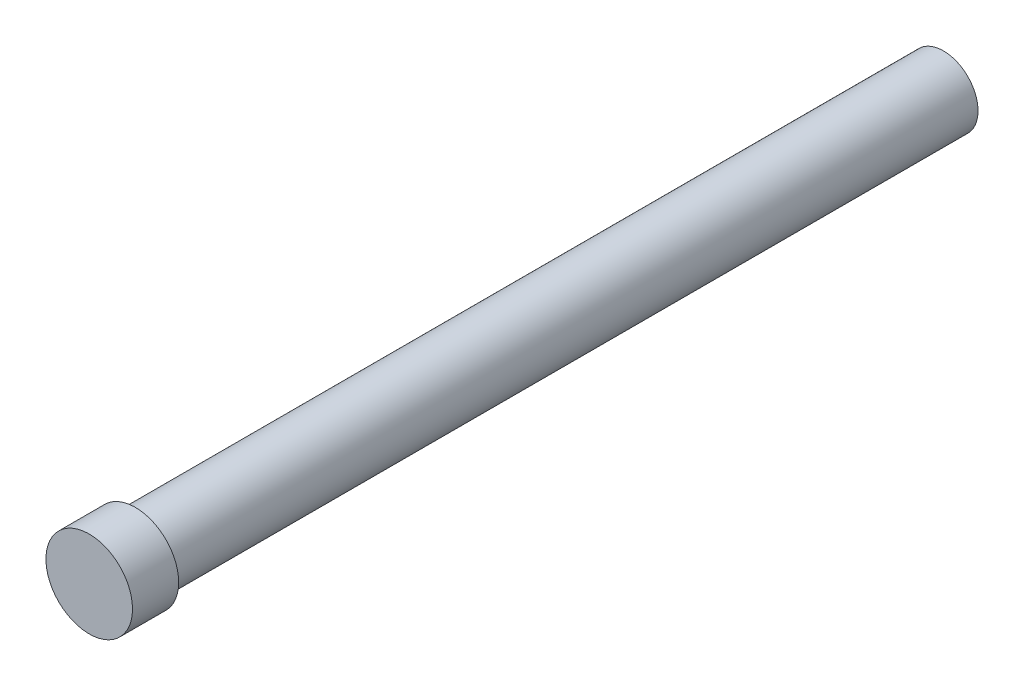
ISO-10303-21;
HEADER;
FILE_DESCRIPTION(('STEP AP214'),'2;1');
FILE_NAME('part.step','',(''),(''),'','','');
FILE_SCHEMA(('AUTOMOTIVE_DESIGN { 1 0 10303 214 1 1 1 1 }'));
ENDSEC;
DATA;
#1=APPLICATION_CONTEXT('core data for automotive mechanical design processes');
#2=APPLICATION_PROTOCOL_DEFINITION('international standard','automotive_design',2000,#1);
#3=PRODUCT_CONTEXT('',#1,'mechanical');
#4=PRODUCT('Part','Part','',(#3));
#5=PRODUCT_RELATED_PRODUCT_CATEGORY('part','',(#4));
#6=PRODUCT_DEFINITION_FORMATION('','',#4);
#7=PRODUCT_DEFINITION_CONTEXT('part definition',#1,'design');
#8=PRODUCT_DEFINITION('design','',#6,#7);
#9=PRODUCT_DEFINITION_SHAPE('','',#8);
#10=(LENGTH_UNIT() NAMED_UNIT(*) SI_UNIT(.MILLI.,.METRE.));
#11=(NAMED_UNIT(*) PLANE_ANGLE_UNIT() SI_UNIT($,.RADIAN.));
#12=(NAMED_UNIT(*) SI_UNIT($,.STERADIAN.) SOLID_ANGLE_UNIT());
#13=UNCERTAINTY_MEASURE_WITH_UNIT(LENGTH_MEASURE(1.E-05),#10,'distance_accuracy_value','');
#14=(GEOMETRIC_REPRESENTATION_CONTEXT(3) GLOBAL_UNCERTAINTY_ASSIGNED_CONTEXT((#13)) GLOBAL_UNIT_ASSIGNED_CONTEXT((#10,
#11,#12)) REPRESENTATION_CONTEXT('',''));
#15=CARTESIAN_POINT('',(0.,0.,0.));
#16=DIRECTION('',(0.,0.,1.));
#17=DIRECTION('',(1.,0.,0.));
#18=AXIS2_PLACEMENT_3D('',#15,#16,#17);
#19=CARTESIAN_POINT('',(0.,0.,8.));
#20=DIRECTION('',(0.,0.,-1.));
#21=DIRECTION('',(-1.,0.,0.));
#22=AXIS2_PLACEMENT_3D('',#19,#20,#21);
#23=CYLINDRICAL_SURFACE('',#22,7.5);
#24=CARTESIAN_POINT('',(0.,0.,8.));
#25=DIRECTION('',(0.,0.,1.));
#26=DIRECTION('',(1.,0.,0.));
#27=AXIS2_PLACEMENT_3D('',#24,#25,#26);
#28=CIRCLE('',#27,7.5);
#29=CARTESIAN_POINT('',(7.5,0.,8.));
#30=VERTEX_POINT('',#29);
#31=EDGE_CURVE('E38',#30,#30,#28,.T.);
#32=ORIENTED_EDGE('',*,*,#31,.F.);
#33=EDGE_LOOP('',(#32));
#34=FACE_BOUND('',#33,.T.);
#35=CARTESIAN_POINT('',(0.,0.,0.));
#36=DIRECTION('',(0.,0.,1.));
#37=DIRECTION('',(1.,0.,0.));
#38=AXIS2_PLACEMENT_3D('',#35,#36,#37);
#39=CIRCLE('',#38,7.5);
#40=CARTESIAN_POINT('',(7.5,0.,0.));
#41=VERTEX_POINT('',#40);
#42=EDGE_CURVE('E34',#41,#41,#39,.T.);
#43=ORIENTED_EDGE('',*,*,#42,.T.);
#44=EDGE_LOOP('',(#43));
#45=FACE_BOUND('',#44,.T.);
#46=ADVANCED_FACE('F31',(#34,#45),#23,.T.);
#47=CARTESIAN_POINT('',(0.,0.,8.));
#48=DIRECTION('',(0.,0.,1.));
#49=DIRECTION('',(1.,0.,0.));
#50=AXIS2_PLACEMENT_3D('',#47,#48,#49);
#51=PLANE('',#50);
#52=ORIENTED_EDGE('',*,*,#31,.T.);
#53=EDGE_LOOP('',(#52));
#54=FACE_BOUND('',#53,.T.);
#55=ADVANCED_FACE('F55',(#54),#51,.T.);
#56=CARTESIAN_POINT('',(0.,0.,0.));
#57=DIRECTION('',(0.,0.,1.));
#58=DIRECTION('',(1.,0.,0.));
#59=AXIS2_PLACEMENT_3D('',#56,#57,#58);
#60=PLANE('',#59);
#61=CARTESIAN_POINT('',(0.,0.,0.));
#62=DIRECTION('',(0.,0.,-1.));
#63=DIRECTION('',(-1.,0.,0.));
#64=AXIS2_PLACEMENT_3D('',#61,#62,#63);
#65=CIRCLE('',#64,6.);
#66=CARTESIAN_POINT('',(-6.,0.,0.));
#67=VERTEX_POINT('',#66);
#68=EDGE_CURVE('E10',#67,#67,#65,.T.);
#69=ORIENTED_EDGE('',*,*,#68,.F.);
#70=EDGE_LOOP('',(#69));
#71=FACE_BOUND('',#70,.T.);
#72=ORIENTED_EDGE('',*,*,#42,.F.);
#73=EDGE_LOOP('',(#72));
#74=FACE_BOUND('',#73,.T.);
#75=ADVANCED_FACE('F52',(#71,#74),#60,.F.);
#76=CARTESIAN_POINT('',(0.,0.,-140.));
#77=DIRECTION('',(0.,0.,1.));
#78=DIRECTION('',(1.,0.,0.));
#79=AXIS2_PLACEMENT_3D('',#76,#77,#78);
#80=CYLINDRICAL_SURFACE('',#79,6.);
#81=CARTESIAN_POINT('',(0.,0.,-140.));
#82=DIRECTION('',(0.,0.,-1.));
#83=DIRECTION('',(-1.,0.,0.));
#84=AXIS2_PLACEMENT_3D('',#81,#82,#83);
#85=CIRCLE('',#84,6.);
#86=CARTESIAN_POINT('',(-6.,0.,-140.));
#87=VERTEX_POINT('',#86);
#88=EDGE_CURVE('E44',#87,#87,#85,.T.);
#89=ORIENTED_EDGE('',*,*,#88,.F.);
#90=EDGE_LOOP('',(#89));
#91=FACE_BOUND('',#90,.T.);
#92=ORIENTED_EDGE('',*,*,#68,.T.);
#93=EDGE_LOOP('',(#92));
#94=FACE_BOUND('',#93,.T.);
#95=ADVANCED_FACE('F54',(#91,#94),#80,.T.);
#96=CARTESIAN_POINT('',(0.,0.,-140.));
#97=DIRECTION('',(0.,0.,-1.));
#98=DIRECTION('',(-1.,0.,0.));
#99=AXIS2_PLACEMENT_3D('',#96,#97,#98);
#100=PLANE('',#99);
#101=ORIENTED_EDGE('',*,*,#88,.T.);
#102=EDGE_LOOP('',(#101));
#103=FACE_BOUND('',#102,.T.);
#104=ADVANCED_FACE('F61',(#103),#100,.T.);
#105=CLOSED_SHELL('',(#46,#55,#75,#95,#104));
#106=MANIFOLD_SOLID_BREP('B2',#105);
#107=ADVANCED_BREP_SHAPE_REPRESENTATION('',(#18,#106),#14);
#108=SHAPE_DEFINITION_REPRESENTATION(#9,#107);
ENDSEC;
END-ISO-10303-21;
